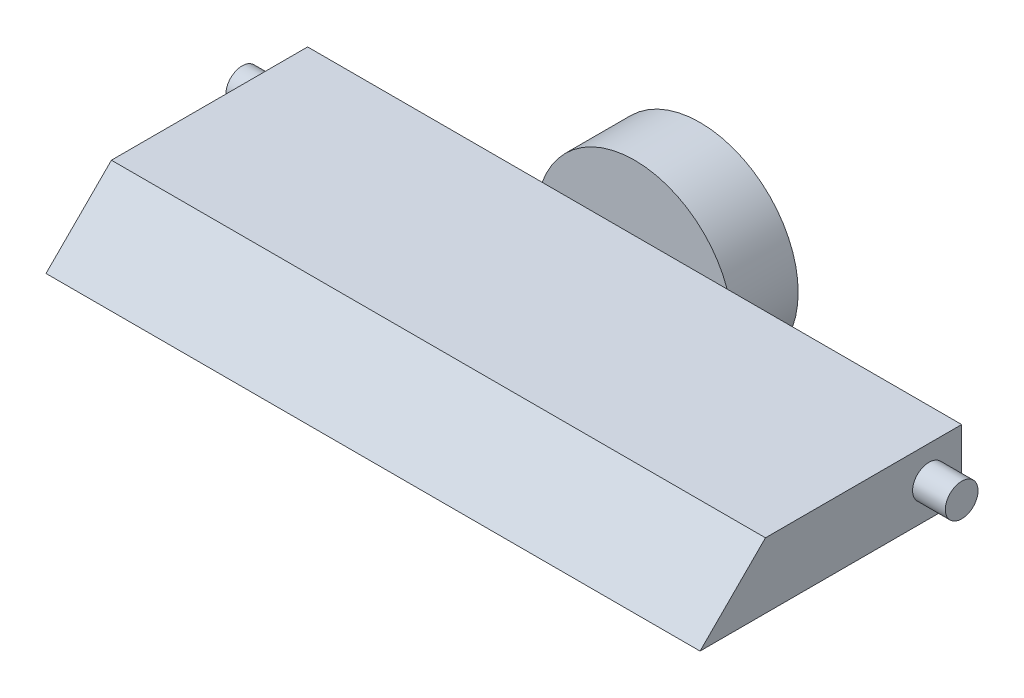
ISO-10303-21;
HEADER;
FILE_DESCRIPTION(('STEP AP214'),'2;1');
FILE_NAME('part.step','',(''),(''),'','','');
FILE_SCHEMA(('AUTOMOTIVE_DESIGN { 1 0 10303 214 1 1 1 1 }'));
ENDSEC;
DATA;
#1=APPLICATION_CONTEXT('core data for automotive mechanical design processes');
#2=APPLICATION_PROTOCOL_DEFINITION('international standard','automotive_design',2000,#1);
#3=PRODUCT_CONTEXT('',#1,'mechanical');
#4=PRODUCT('Part','Part','',(#3));
#5=PRODUCT_RELATED_PRODUCT_CATEGORY('part','',(#4));
#6=PRODUCT_DEFINITION_FORMATION('','',#4);
#7=PRODUCT_DEFINITION_CONTEXT('part definition',#1,'design');
#8=PRODUCT_DEFINITION('design','',#6,#7);
#9=PRODUCT_DEFINITION_SHAPE('','',#8);
#10=(LENGTH_UNIT() NAMED_UNIT(*) SI_UNIT(.MILLI.,.METRE.));
#11=(NAMED_UNIT(*) PLANE_ANGLE_UNIT() SI_UNIT($,.RADIAN.));
#12=(NAMED_UNIT(*) SI_UNIT($,.STERADIAN.) SOLID_ANGLE_UNIT());
#13=UNCERTAINTY_MEASURE_WITH_UNIT(LENGTH_MEASURE(1.E-05),#10,'distance_accuracy_value','');
#14=(GEOMETRIC_REPRESENTATION_CONTEXT(3) GLOBAL_UNCERTAINTY_ASSIGNED_CONTEXT((#13)) GLOBAL_UNIT_ASSIGNED_CONTEXT((#10,
#11,#12)) REPRESENTATION_CONTEXT('',''));
#15=CARTESIAN_POINT('',(0.,0.,0.));
#16=DIRECTION('',(0.,0.,1.));
#17=DIRECTION('',(1.,0.,0.));
#18=AXIS2_PLACEMENT_3D('',#15,#16,#17);
#19=CARTESIAN_POINT('',(0.,0.,-150.611129215572));
#20=DIRECTION('',(0.,0.,1.));
#21=DIRECTION('',(1.,0.,0.));
#22=AXIS2_PLACEMENT_3D('',#19,#20,#21);
#23=PLANE('',#22);
#24=CARTESIAN_POINT('',(-43.5410132659269,-149.954890483554,-150.611129215572));
#25=DIRECTION('',(0.,0.,-1.));
#26=DIRECTION('',(-1.,0.,0.));
#27=AXIS2_PLACEMENT_3D('',#24,#25,#26);
#28=CIRCLE('',#27,2.99999999999999);
#29=CARTESIAN_POINT('',(-40.7125861411807,-148.954890483554,-150.611129215572));
#30=VERTEX_POINT('',#29);
#31=CARTESIAN_POINT('',(-40.7125861411807,-150.954890483554,-150.611129215572));
#32=VERTEX_POINT('',#31);
#33=EDGE_CURVE('E11',#30,#32,#28,.T.);
#34=ORIENTED_EDGE('',*,*,#33,.F.);
#35=DIRECTION('',(-1.,0.,0.));
#36=VECTOR('',#35,1.);
#37=CARTESIAN_POINT('',(-33.5410132659269,-148.954890483554,-150.611129215572));
#38=LINE('',#37,#36);
#39=CARTESIAN_POINT('',(-33.5410132659269,-148.954890483554,-150.611129215572));
#40=VERTEX_POINT('',#39);
#41=EDGE_CURVE('E102',#40,#30,#38,.T.);
#42=ORIENTED_EDGE('',*,*,#41,.F.);
#43=DIRECTION('',(0.,1.,0.));
#44=VECTOR('',#43,1.);
#45=CARTESIAN_POINT('',(-33.5410132659269,-150.954890483554,-150.611129215572));
#46=LINE('',#45,#44);
#47=CARTESIAN_POINT('',(-33.5410132659269,-150.954890483554,-150.611129215572));
#48=VERTEX_POINT('',#47);
#49=EDGE_CURVE('E111',#48,#40,#46,.T.);
#50=ORIENTED_EDGE('',*,*,#49,.F.);
#51=DIRECTION('',(1.,0.,0.));
#52=VECTOR('',#51,1.);
#53=CARTESIAN_POINT('',(-53.5410132659269,-150.954890483554,-150.611129215572));
#54=LINE('',#53,#52);
#55=EDGE_CURVE('E56',#32,#48,#54,.T.);
#56=ORIENTED_EDGE('',*,*,#55,.F.);
#57=EDGE_LOOP('',(#34,#42,#50,#56));
#58=FACE_BOUND('',#57,.T.);
#59=ADVANCED_FACE('F38',(#58),#23,.F.);
#60=CARTESIAN_POINT('',(-53.5410132659269,-148.954890483554,-150.611129215572));
#61=DIRECTION('',(-1.,0.,0.));
#62=DIRECTION('',(0.,0.,1.));
#63=AXIS2_PLACEMENT_3D('',#60,#61,#62);
#64=PLANE('',#63);
#65=CARTESIAN_POINT('',(-53.5410132659269,-149.954890483554,-149.611129215572));
#66=DIRECTION('',(-1.,0.,0.));
#67=DIRECTION('',(0.,0.,1.));
#68=AXIS2_PLACEMENT_3D('',#65,#66,#67);
#69=CIRCLE('',#68,0.499999999999999);
#70=CARTESIAN_POINT('',(-53.5410132659269,-149.954890483554,-149.111129215572));
#71=VERTEX_POINT('',#70);
#72=EDGE_CURVE('E125',#71,#71,#69,.T.);
#73=ORIENTED_EDGE('',*,*,#72,.F.);
#74=EDGE_LOOP('',(#73));
#75=FACE_BOUND('',#74,.T.);
#76=DIRECTION('',(0.,-0.707106781186547,0.707106781186547));
#77=VECTOR('',#76,1.);
#78=CARTESIAN_POINT('',(-53.5410132659269,-150.954890483554,-142.611129215572));
#79=LINE('',#78,#77);
#80=CARTESIAN_POINT('',(-53.5410132659269,-148.954890483554,-144.611129215572));
#81=VERTEX_POINT('',#80);
#82=CARTESIAN_POINT('',(-53.5410132659269,-150.954890483554,-142.611129215572));
#83=VERTEX_POINT('',#82);
#84=EDGE_CURVE('E129',#81,#83,#79,.T.);
#85=ORIENTED_EDGE('',*,*,#84,.F.);
#86=DIRECTION('',(0.,0.,1.));
#87=VECTOR('',#86,1.);
#88=CARTESIAN_POINT('',(-53.5410132659269,-148.954890483554,-150.611129215572));
#89=LINE('',#88,#87);
#90=CARTESIAN_POINT('',(-53.5410132659269,-148.954890483554,-150.611129215572));
#91=VERTEX_POINT('',#90);
#92=EDGE_CURVE('E147',#91,#81,#89,.T.);
#93=ORIENTED_EDGE('',*,*,#92,.F.);
#94=DIRECTION('',(0.,-1.,0.));
#95=VECTOR('',#94,1.);
#96=CARTESIAN_POINT('',(-53.5410132659269,-148.954890483554,-150.611129215572));
#97=LINE('',#96,#95);
#98=CARTESIAN_POINT('',(-53.5410132659269,-150.954890483554,-150.611129215572));
#99=VERTEX_POINT('',#98);
#100=EDGE_CURVE('E110',#91,#99,#97,.T.);
#101=ORIENTED_EDGE('',*,*,#100,.T.);
#102=DIRECTION('',(0.,0.,1.));
#103=VECTOR('',#102,1.);
#104=CARTESIAN_POINT('',(-53.5410132659269,-150.954890483554,-150.611129215572));
#105=LINE('',#104,#103);
#106=EDGE_CURVE('E146',#99,#83,#105,.T.);
#107=ORIENTED_EDGE('',*,*,#106,.T.);
#108=EDGE_LOOP('',(#85,#93,#101,#107));
#109=FACE_BOUND('',#108,.T.);
#110=ADVANCED_FACE('F40',(#75,#109),#64,.T.);
#111=CARTESIAN_POINT('',(-33.5410132659269,-148.954890483554,-150.611129215572));
#112=DIRECTION('',(0.,1.,0.));
#113=DIRECTION('',(0.,0.,1.));
#114=AXIS2_PLACEMENT_3D('',#111,#112,#113);
#115=PLANE('',#114);
#116=DIRECTION('',(-1.,0.,0.));
#117=VECTOR('',#116,1.);
#118=CARTESIAN_POINT('',(-30.7125861411807,-148.954890483554,-144.611129215572));
#119=LINE('',#118,#117);
#120=CARTESIAN_POINT('',(-33.5410132659269,-148.954890483554,-144.611129215572));
#121=VERTEX_POINT('',#120);
#122=EDGE_CURVE('E136',#121,#81,#119,.T.);
#123=ORIENTED_EDGE('',*,*,#122,.F.);
#124=DIRECTION('',(0.,0.,1.));
#125=VECTOR('',#124,1.);
#126=CARTESIAN_POINT('',(-33.5410132659269,-148.954890483554,-150.611129215572));
#127=LINE('',#126,#125);
#128=EDGE_CURVE('E149',#40,#121,#127,.T.);
#129=ORIENTED_EDGE('',*,*,#128,.F.);
#130=ORIENTED_EDGE('',*,*,#41,.T.);
#131=CARTESIAN_POINT('',(-46.369440390673,-148.954890483554,-150.611129215572));
#132=VERTEX_POINT('',#131);
#133=EDGE_CURVE('E95',#30,#132,#38,.T.);
#134=ORIENTED_EDGE('',*,*,#133,.T.);
#135=EDGE_CURVE('E99',#132,#91,#38,.T.);
#136=ORIENTED_EDGE('',*,*,#135,.T.);
#137=ORIENTED_EDGE('',*,*,#92,.T.);
#138=EDGE_LOOP('',(#123,#129,#130,#134,#136,#137));
#139=FACE_BOUND('',#138,.T.);
#140=ADVANCED_FACE('F97',(#139),#115,.T.);
#141=CARTESIAN_POINT('',(-33.5410132659269,-150.954890483554,-150.611129215572));
#142=DIRECTION('',(1.,0.,0.));
#143=DIRECTION('',(0.,0.,-1.));
#144=AXIS2_PLACEMENT_3D('',#141,#142,#143);
#145=PLANE('',#144);
#146=CARTESIAN_POINT('',(-33.5410132659269,-149.954890483554,-149.611129215572));
#147=DIRECTION('',(1.,0.,0.));
#148=DIRECTION('',(0.,0.,-1.));
#149=AXIS2_PLACEMENT_3D('',#146,#147,#148);
#150=CIRCLE('',#149,0.499999999999999);
#151=CARTESIAN_POINT('',(-33.5410132659269,-149.954890483554,-150.111129215572));
#152=VERTEX_POINT('',#151);
#153=EDGE_CURVE('E42',#152,#152,#150,.T.);
#154=ORIENTED_EDGE('',*,*,#153,.F.);
#155=EDGE_LOOP('',(#154));
#156=FACE_BOUND('',#155,.T.);
#157=DIRECTION('',(0.,-0.707106781186548,0.707106781186548));
#158=VECTOR('',#157,1.);
#159=CARTESIAN_POINT('',(-33.5410132659269,-150.954890483554,-142.611129215572));
#160=LINE('',#159,#158);
#161=CARTESIAN_POINT('',(-33.5410132659269,-150.954890483554,-142.611129215572));
#162=VERTEX_POINT('',#161);
#163=EDGE_CURVE('E133',#121,#162,#160,.T.);
#164=ORIENTED_EDGE('',*,*,#163,.T.);
#165=DIRECTION('',(0.,0.,1.));
#166=VECTOR('',#165,1.);
#167=CARTESIAN_POINT('',(-33.5410132659269,-150.954890483554,-150.611129215572));
#168=LINE('',#167,#166);
#169=EDGE_CURVE('E152',#48,#162,#168,.T.);
#170=ORIENTED_EDGE('',*,*,#169,.F.);
#171=ORIENTED_EDGE('',*,*,#49,.T.);
#172=ORIENTED_EDGE('',*,*,#128,.T.);
#173=EDGE_LOOP('',(#164,#170,#171,#172));
#174=FACE_BOUND('',#173,.T.);
#175=ADVANCED_FACE('F164',(#156,#174),#145,.T.);
#176=CARTESIAN_POINT('',(-53.5410132659269,-150.954890483554,-150.611129215572));
#177=DIRECTION('',(0.,-1.,0.));
#178=DIRECTION('',(0.,0.,-1.));
#179=AXIS2_PLACEMENT_3D('',#176,#177,#178);
#180=PLANE('',#179);
#181=ORIENTED_EDGE('',*,*,#169,.T.);
#182=DIRECTION('',(1.,0.,0.));
#183=VECTOR('',#182,1.);
#184=CARTESIAN_POINT('',(-53.5410132659269,-150.954890483554,-142.611129215572));
#185=LINE('',#184,#183);
#186=EDGE_CURVE('E138',#83,#162,#185,.T.);
#187=ORIENTED_EDGE('',*,*,#186,.F.);
#188=ORIENTED_EDGE('',*,*,#106,.F.);
#189=CARTESIAN_POINT('',(-46.3694403906731,-150.954890483554,-150.611129215572));
#190=VERTEX_POINT('',#189);
#191=EDGE_CURVE('E141',#99,#190,#54,.T.);
#192=ORIENTED_EDGE('',*,*,#191,.T.);
#193=EDGE_CURVE('E143',#190,#32,#54,.T.);
#194=ORIENTED_EDGE('',*,*,#193,.T.);
#195=ORIENTED_EDGE('',*,*,#55,.T.);
#196=EDGE_LOOP('',(#181,#187,#188,#192,#194,#195));
#197=FACE_BOUND('',#196,.T.);
#198=ADVANCED_FACE('F159',(#197),#180,.T.);
#199=EDGE_CURVE('E47',#190,#132,#28,.T.);
#200=ORIENTED_EDGE('',*,*,#199,.F.);
#201=ORIENTED_EDGE('',*,*,#191,.F.);
#202=ORIENTED_EDGE('',*,*,#100,.F.);
#203=ORIENTED_EDGE('',*,*,#135,.F.);
#204=EDGE_LOOP('',(#200,#201,#202,#203));
#205=FACE_BOUND('',#204,.T.);
#206=ADVANCED_FACE('F108',(#205),#23,.F.);
#207=CARTESIAN_POINT('',(-30.7125861411807,-150.954890483554,-142.611129215572));
#208=DIRECTION('',(0.,-0.707106781186548,-0.707106781186548));
#209=DIRECTION('',(0.,0.707106781186548,-0.707106781186548));
#210=AXIS2_PLACEMENT_3D('',#207,#208,#209);
#211=PLANE('',#210);
#212=ORIENTED_EDGE('',*,*,#122,.T.);
#213=ORIENTED_EDGE('',*,*,#84,.T.);
#214=ORIENTED_EDGE('',*,*,#186,.T.);
#215=ORIENTED_EDGE('',*,*,#163,.F.);
#216=EDGE_LOOP('',(#212,#213,#214,#215));
#217=FACE_BOUND('',#216,.T.);
#218=ADVANCED_FACE('F162',(#217),#211,.F.);
#219=CARTESIAN_POINT('',(-54.5410132659269,-149.954890483554,-149.611129215572));
#220=DIRECTION('',(1.,0.,0.));
#221=DIRECTION('',(0.,0.,-1.));
#222=AXIS2_PLACEMENT_3D('',#219,#220,#221);
#223=CYLINDRICAL_SURFACE('',#222,0.499999999999999);
#224=CARTESIAN_POINT('',(-54.5410132659269,-149.954890483554,-149.611129215572));
#225=DIRECTION('',(-1.,0.,0.));
#226=DIRECTION('',(0.,0.,1.));
#227=AXIS2_PLACEMENT_3D('',#224,#225,#226);
#228=CIRCLE('',#227,0.499999999999999);
#229=CARTESIAN_POINT('',(-54.5410132659269,-149.954890483554,-149.111129215572));
#230=VERTEX_POINT('',#229);
#231=EDGE_CURVE('E126',#230,#230,#228,.T.);
#232=ORIENTED_EDGE('',*,*,#231,.F.);
#233=EDGE_LOOP('',(#232));
#234=FACE_BOUND('',#233,.T.);
#235=ORIENTED_EDGE('',*,*,#72,.T.);
#236=EDGE_LOOP('',(#235));
#237=FACE_BOUND('',#236,.T.);
#238=ADVANCED_FACE('F178',(#234,#237),#223,.T.);
#239=CARTESIAN_POINT('',(-54.5410132659269,-149.954890483554,-149.611129215572));
#240=DIRECTION('',(-1.,0.,0.));
#241=DIRECTION('',(0.,0.,1.));
#242=AXIS2_PLACEMENT_3D('',#239,#240,#241);
#243=PLANE('',#242);
#244=ORIENTED_EDGE('',*,*,#231,.T.);
#245=EDGE_LOOP('',(#244));
#246=FACE_BOUND('',#245,.T.);
#247=ADVANCED_FACE('F201',(#246),#243,.T.);
#248=CARTESIAN_POINT('',(-32.5410132659269,-149.954890483554,-149.611129215572));
#249=DIRECTION('',(-1.,0.,0.));
#250=DIRECTION('',(0.,0.,1.));
#251=AXIS2_PLACEMENT_3D('',#248,#249,#250);
#252=CYLINDRICAL_SURFACE('',#251,0.499999999999999);
#253=CARTESIAN_POINT('',(-32.5410132659269,-149.954890483554,-149.611129215572));
#254=DIRECTION('',(-1.,0.,0.));
#255=DIRECTION('',(0.,0.,1.));
#256=AXIS2_PLACEMENT_3D('',#253,#254,#255);
#257=CIRCLE('',#256,0.499999999999999);
#258=CARTESIAN_POINT('',(-32.5410132659269,-149.954890483554,-149.111129215572));
#259=VERTEX_POINT('',#258);
#260=EDGE_CURVE('E120',#259,#259,#257,.T.);
#261=ORIENTED_EDGE('',*,*,#260,.T.);
#262=EDGE_LOOP('',(#261));
#263=FACE_BOUND('',#262,.T.);
#264=ORIENTED_EDGE('',*,*,#153,.T.);
#265=EDGE_LOOP('',(#264));
#266=FACE_BOUND('',#265,.T.);
#267=ADVANCED_FACE('F206',(#263,#266),#252,.T.);
#268=CARTESIAN_POINT('',(-32.5410132659269,-149.954890483554,-149.611129215572));
#269=DIRECTION('',(1.,0.,0.));
#270=DIRECTION('',(0.,0.,1.));
#271=AXIS2_PLACEMENT_3D('',#268,#269,#270);
#272=PLANE('',#271);
#273=ORIENTED_EDGE('',*,*,#260,.F.);
#274=EDGE_LOOP('',(#273));
#275=FACE_BOUND('',#274,.T.);
#276=ADVANCED_FACE('F211',(#275),#272,.T.);
#277=CARTESIAN_POINT('',(-43.5410132659269,-149.954890483554,-150.611129215572));
#278=DIRECTION('',(0.,0.,-1.));
#279=DIRECTION('',(-1.,0.,0.));
#280=AXIS2_PLACEMENT_3D('',#277,#278,#279);
#281=PLANE('',#280);
#282=ORIENTED_EDGE('',*,*,#133,.F.);
#283=EDGE_CURVE('E115',#132,#30,#28,.T.);
#284=ORIENTED_EDGE('',*,*,#283,.F.);
#285=EDGE_LOOP('',(#282,#284));
#286=FACE_BOUND('',#285,.T.);
#287=ADVANCED_FACE('F117',(#286),#281,.F.);
#288=CARTESIAN_POINT('',(-43.5410132659269,-149.954890483554,-152.611129215572));
#289=DIRECTION('',(0.,0.,1.));
#290=DIRECTION('',(1.,0.,0.));
#291=AXIS2_PLACEMENT_3D('',#288,#289,#290);
#292=CYLINDRICAL_SURFACE('',#291,2.99999999999999);
#293=CARTESIAN_POINT('',(-43.5410132659269,-149.954890483554,-152.611129215572));
#294=DIRECTION('',(0.,0.,-1.));
#295=DIRECTION('',(-1.,0.,0.));
#296=AXIS2_PLACEMENT_3D('',#293,#294,#295);
#297=CIRCLE('',#296,2.99999999999999);
#298=CARTESIAN_POINT('',(-46.5410132659269,-149.954890483554,-152.611129215572));
#299=VERTEX_POINT('',#298);
#300=EDGE_CURVE('E118',#299,#299,#297,.T.);
#301=ORIENTED_EDGE('',*,*,#300,.F.);
#302=EDGE_LOOP('',(#301));
#303=FACE_BOUND('',#302,.T.);
#304=ORIENTED_EDGE('',*,*,#283,.T.);
#305=ORIENTED_EDGE('',*,*,#33,.T.);
#306=EDGE_CURVE('E49',#32,#190,#28,.T.);
#307=ORIENTED_EDGE('',*,*,#306,.T.);
#308=ORIENTED_EDGE('',*,*,#199,.T.);
#309=EDGE_LOOP('',(#304,#305,#307,#308));
#310=FACE_BOUND('',#309,.T.);
#311=ADVANCED_FACE('F114',(#303,#310),#292,.T.);
#312=CARTESIAN_POINT('',(-43.5410132659269,-149.954890483554,-152.611129215572));
#313=DIRECTION('',(0.,0.,-1.));
#314=DIRECTION('',(-1.,0.,0.));
#315=AXIS2_PLACEMENT_3D('',#312,#313,#314);
#316=PLANE('',#315);
#317=ORIENTED_EDGE('',*,*,#300,.T.);
#318=EDGE_LOOP('',(#317));
#319=FACE_BOUND('',#318,.T.);
#320=ADVANCED_FACE('F248',(#319),#316,.T.);
#321=ORIENTED_EDGE('',*,*,#193,.F.);
#322=ORIENTED_EDGE('',*,*,#306,.F.);
#323=EDGE_LOOP('',(#321,#322));
#324=FACE_BOUND('',#323,.T.);
#325=ADVANCED_FACE('F240',(#324),#281,.F.);
#326=CLOSED_SHELL('',(#59,#110,#140,#175,#198,#206,#218,#238,#247,#267,#276,#287,#311,#320,#325));
#327=MANIFOLD_SOLID_BREP('B2',#326);
#328=ADVANCED_BREP_SHAPE_REPRESENTATION('',(#18,#327),#14);
#329=SHAPE_DEFINITION_REPRESENTATION(#9,#328);
ENDSEC;
END-ISO-10303-21;
